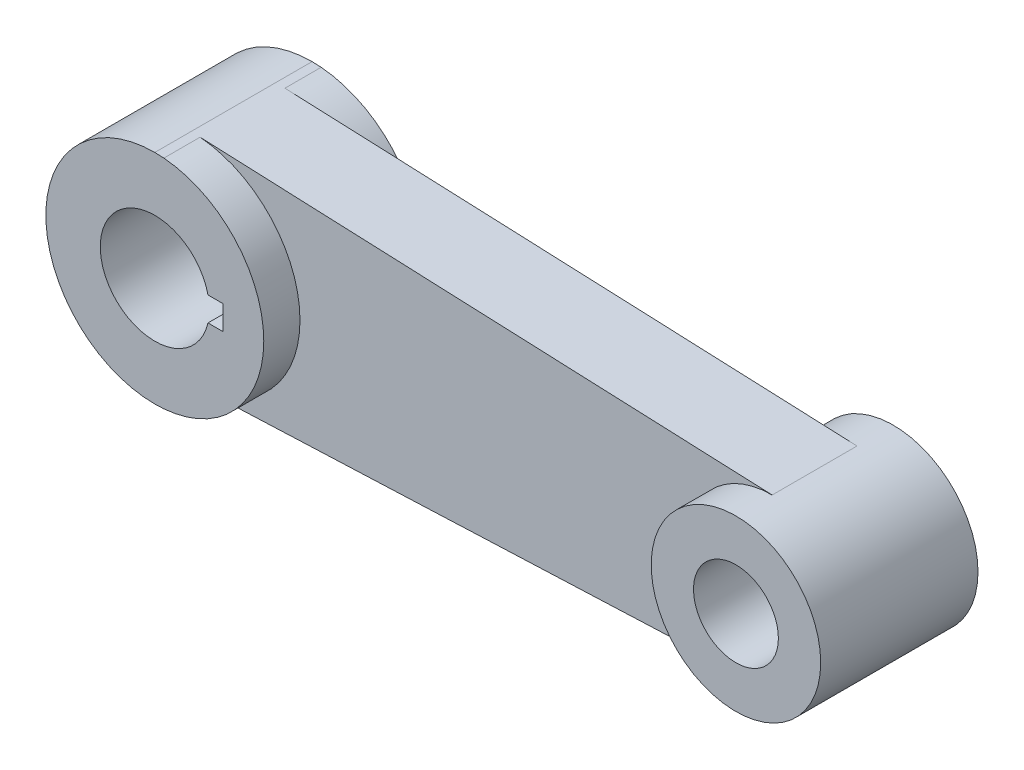
ISO-10303-21;
HEADER;
FILE_DESCRIPTION(('STEP AP214'),'2;1');
FILE_NAME('part.step','',(''),(''),'','','');
FILE_SCHEMA(('AUTOMOTIVE_DESIGN { 1 0 10303 214 1 1 1 1 }'));
ENDSEC;
DATA;
#1=APPLICATION_CONTEXT('core data for automotive mechanical design processes');
#2=APPLICATION_PROTOCOL_DEFINITION('international standard','automotive_design',2000,#1);
#3=PRODUCT_CONTEXT('',#1,'mechanical');
#4=PRODUCT('Part','Part','',(#3));
#5=PRODUCT_RELATED_PRODUCT_CATEGORY('part','',(#4));
#6=PRODUCT_DEFINITION_FORMATION('','',#4);
#7=PRODUCT_DEFINITION_CONTEXT('part definition',#1,'design');
#8=PRODUCT_DEFINITION('design','',#6,#7);
#9=PRODUCT_DEFINITION_SHAPE('','',#8);
#10=(LENGTH_UNIT() NAMED_UNIT(*) SI_UNIT(.MILLI.,.METRE.));
#11=(NAMED_UNIT(*) PLANE_ANGLE_UNIT() SI_UNIT($,.RADIAN.));
#12=(NAMED_UNIT(*) SI_UNIT($,.STERADIAN.) SOLID_ANGLE_UNIT());
#13=UNCERTAINTY_MEASURE_WITH_UNIT(LENGTH_MEASURE(1.E-05),#10,'distance_accuracy_value','');
#14=(GEOMETRIC_REPRESENTATION_CONTEXT(3) GLOBAL_UNCERTAINTY_ASSIGNED_CONTEXT((#13)) GLOBAL_UNIT_ASSIGNED_CONTEXT((#10,
#11,#12)) REPRESENTATION_CONTEXT('',''));
#15=CARTESIAN_POINT('',(0.,0.,0.));
#16=DIRECTION('',(0.,0.,1.));
#17=DIRECTION('',(1.,0.,0.));
#18=AXIS2_PLACEMENT_3D('',#15,#16,#17);
#19=CARTESIAN_POINT('',(0.,0.,0.));
#20=DIRECTION('',(0.,0.,0.999999999999987));
#21=DIRECTION('',(1.00000000000001,0.,0.));
#22=AXIS2_PLACEMENT_3D('',#19,#20,#21);
#23=PLANE('',#22);
#24=DIRECTION('',(0.999133073092356,0.0416305447121818,0.));
#25=VECTOR('',#24,1.);
#26=CARTESIAN_POINT('',(0.594280762564944,-14.2627383015598,0.));
#27=LINE('',#26,#25);
#28=CARTESIAN_POINT('',(1.18856152512999,-14.2379766031196,0.));
#29=VERTEX_POINT('',#28);
#30=CARTESIAN_POINT('',(76.2000000000002,-11.1125,-5.27355936696949E-13));
#31=VERTEX_POINT('',#30);
#32=EDGE_CURVE('E171',#29,#31,#27,.T.);
#33=ORIENTED_EDGE('',*,*,#32,.T.);
#34=CARTESIAN_POINT('',(76.2,1.17961196366423E-13,-8.60422844084496E-13));
#35=DIRECTION('',(0.,0.,0.999999999999987));
#36=DIRECTION('',(1.00000000000001,0.,0.));
#37=AXIS2_PLACEMENT_3D('',#34,#35,#36);
#38=CIRCLE('',#37,11.1125);
#39=CARTESIAN_POINT('',(76.2000000000007,11.1125000000001,-8.04911692853238E-13));
#40=VERTEX_POINT('',#39);
#41=EDGE_CURVE('E156',#40,#31,#38,.T.);
#42=ORIENTED_EDGE('',*,*,#41,.F.);
#43=DIRECTION('',(0.999133073092362,-0.0416305447121823,0.));
#44=VECTOR('',#43,1.);
#45=CARTESIAN_POINT('',(0.594280762564986,14.2627383015601,-1.11022302462516E-13));
#46=LINE('',#45,#44);
#47=CARTESIAN_POINT('',(1.18856152512964,14.2379766031199,-3.05311331771918E-13));
#48=VERTEX_POINT('',#47);
#49=EDGE_CURVE('E61',#48,#40,#46,.T.);
#50=ORIENTED_EDGE('',*,*,#49,.F.);
#51=CARTESIAN_POINT('',(0.,0.,0.));
#52=DIRECTION('',(0.,0.,0.999999999999987));
#53=DIRECTION('',(1.00000000000001,0.,0.));
#54=AXIS2_PLACEMENT_3D('',#51,#52,#53);
#55=CIRCLE('',#54,14.2875);
#56=EDGE_CURVE('E180',#29,#48,#55,.T.);
#57=ORIENTED_EDGE('',*,*,#56,.F.);
#58=EDGE_LOOP('',(#33,#42,#50,#57));
#59=FACE_BOUND('',#58,.T.);
#60=ADVANCED_FACE('F38',(#59),#23,.T.);
#61=CARTESIAN_POINT('',(0.,0.,4.74980000000005));
#62=DIRECTION('',(0.,0.,-0.999999999999987));
#63=DIRECTION('',(-1.00000000000001,0.,0.));
#64=AXIS2_PLACEMENT_3D('',#61,#62,#63);
#65=CYLINDRICAL_SURFACE('',#64,14.2875);
#66=CARTESIAN_POINT('',(0.,0.,-11.1251999999999));
#67=DIRECTION('',(0.,0.,0.999999999999987));
#68=DIRECTION('',(1.00000000000001,0.,0.));
#69=AXIS2_PLACEMENT_3D('',#66,#67,#68);
#70=CIRCLE('',#69,14.2875);
#71=CARTESIAN_POINT('',(1.18856152512992,-14.2379766031196,-11.1251999999999));
#72=VERTEX_POINT('',#71);
#73=CARTESIAN_POINT('',(1.18856152513,14.2379766031199,-11.1251999999998));
#74=VERTEX_POINT('',#73);
#75=EDGE_CURVE('E173',#72,#74,#70,.T.);
#76=ORIENTED_EDGE('',*,*,#75,.F.);
#77=DIRECTION('',(0.,0.,-0.999999999999987));
#78=VECTOR('',#77,1.);
#79=CARTESIAN_POINT('',(1.18856152512993,-14.2379766031196,4.74979999999997));
#80=LINE('',#79,#78);
#81=CARTESIAN_POINT('',(1.18856152513007,-14.2379766031197,-15.8749999999996));
#82=VERTEX_POINT('',#81);
#83=EDGE_CURVE('E214',#72,#82,#80,.T.);
#84=ORIENTED_EDGE('',*,*,#83,.T.);
#85=CARTESIAN_POINT('',(0.,0.,-15.8749999999998));
#86=DIRECTION('',(0.,0.,0.999999999999987));
#87=DIRECTION('',(1.00000000000001,0.,0.));
#88=AXIS2_PLACEMENT_3D('',#85,#86,#87);
#89=CIRCLE('',#88,14.2875);
#90=CARTESIAN_POINT('',(1.18856152512999,14.2379766031199,-15.8749999999998));
#91=VERTEX_POINT('',#90);
#92=EDGE_CURVE('E197',#82,#91,#89,.T.);
#93=ORIENTED_EDGE('',*,*,#92,.T.);
#94=DIRECTION('',(0.,0.,-0.999999999999987));
#95=VECTOR('',#94,1.);
#96=CARTESIAN_POINT('',(1.18856152512987,14.2379766031199,4.74979999999992));
#97=LINE('',#96,#95);
#98=EDGE_CURVE('E215',#74,#91,#97,.T.);
#99=ORIENTED_EDGE('',*,*,#98,.F.);
#100=EDGE_LOOP('',(#76,#84,#93,#99));
#101=FACE_BOUND('',#100,.T.);
#102=ADVANCED_FACE('F248',(#101),#65,.T.);
#103=CARTESIAN_POINT('',(0.594280762564875,14.26273830156,4.74979999999997));
#104=DIRECTION('',(0.0416305447121815,0.999133073092369,0.));
#105=DIRECTION('',(-0.999133073092362,0.0416305447121823,0.));
#106=AXIS2_PLACEMENT_3D('',#103,#104,#105);
#107=PLANE('',#106);
#108=CARTESIAN_POINT('',(1.18856152512987,14.2379766031199,4.74979999999992));
#109=VERTEX_POINT('',#108);
#110=EDGE_CURVE('E211',#109,#48,#97,.T.);
#111=ORIENTED_EDGE('',*,*,#110,.T.);
#112=ORIENTED_EDGE('',*,*,#49,.T.);
#113=DIRECTION('',(0.,0.,0.999999999999987));
#114=VECTOR('',#113,1.);
#115=CARTESIAN_POINT('',(76.2000000000008,11.1125000000002,-11.1252000000007));
#116=LINE('',#115,#114);
#117=CARTESIAN_POINT('',(76.2000000000008,11.1125000000002,-11.1252000000007));
#118=VERTEX_POINT('',#117);
#119=EDGE_CURVE('E178',#118,#40,#116,.T.);
#120=ORIENTED_EDGE('',*,*,#119,.F.);
#121=DIRECTION('',(0.999133073092362,-0.0416305447121823,0.));
#122=VECTOR('',#121,1.);
#123=CARTESIAN_POINT('',(0.594280762564972,14.2627383015601,-11.1251999999999));
#124=LINE('',#123,#122);
#125=EDGE_CURVE('E170',#74,#118,#124,.T.);
#126=ORIENTED_EDGE('',*,*,#125,.F.);
#127=ORIENTED_EDGE('',*,*,#98,.T.);
#128=DIRECTION('',(0.999133073092362,-0.0416305447121823,0.));
#129=VECTOR('',#128,1.);
#130=CARTESIAN_POINT('',(0.594280762564972,14.2627383015601,-15.875));
#131=LINE('',#130,#129);
#132=CARTESIAN_POINT('',(0.,14.2875000000003,-15.8749999999999));
#133=VERTEX_POINT('',#132);
#134=EDGE_CURVE('E190',#133,#91,#131,.T.);
#135=ORIENTED_EDGE('',*,*,#134,.F.);
#136=DIRECTION('',(0.,0.,-0.999999999999987));
#137=VECTOR('',#136,1.);
#138=CARTESIAN_POINT('',(-1.11022302462516E-13,14.2875000000003,4.74979999999978));
#139=LINE('',#138,#137);
#140=CARTESIAN_POINT('',(-1.11022302462516E-13,14.2875000000003,4.74979999999978));
#141=VERTEX_POINT('',#140);
#142=EDGE_CURVE('E221',#141,#133,#139,.T.);
#143=ORIENTED_EDGE('',*,*,#142,.F.);
#144=DIRECTION('',(0.999133073092362,-0.0416305447121823,0.));
#145=VECTOR('',#144,1.);
#146=CARTESIAN_POINT('',(0.594280762564875,14.26273830156,4.74979999999997));
#147=LINE('',#146,#145);
#148=EDGE_CURVE('E201',#141,#109,#147,.T.);
#149=ORIENTED_EDGE('',*,*,#148,.T.);
#150=EDGE_LOOP('',(#111,#112,#120,#126,#127,#135,#143,#149));
#151=FACE_BOUND('',#150,.T.);
#152=ADVANCED_FACE('F253',(#151),#107,.T.);
#153=ORIENTED_EDGE('',*,*,#142,.T.);
#154=CARTESIAN_POINT('',(0.,-14.2875,-15.8749999999997));
#155=VERTEX_POINT('',#154);
#156=EDGE_CURVE('E193',#133,#155,#89,.T.);
#157=ORIENTED_EDGE('',*,*,#156,.T.);
#158=DIRECTION('',(0.,0.,-0.999999999999987));
#159=VECTOR('',#158,1.);
#160=CARTESIAN_POINT('',(0.,-14.2875,4.74979999999994));
#161=LINE('',#160,#159);
#162=CARTESIAN_POINT('',(0.,-14.2875,4.74979999999994));
#163=VERTEX_POINT('',#162);
#164=EDGE_CURVE('E219',#163,#155,#161,.T.);
#165=ORIENTED_EDGE('',*,*,#164,.F.);
#166=CARTESIAN_POINT('',(0.,0.,4.74980000000005));
#167=DIRECTION('',(0.,0.,0.999999999999987));
#168=DIRECTION('',(1.00000000000001,0.,0.));
#169=AXIS2_PLACEMENT_3D('',#166,#167,#168);
#170=CIRCLE('',#169,14.2875);
#171=EDGE_CURVE('E204',#141,#163,#170,.T.);
#172=ORIENTED_EDGE('',*,*,#171,.F.);
#173=EDGE_LOOP('',(#153,#157,#165,#172));
#174=FACE_BOUND('',#173,.T.);
#175=ADVANCED_FACE('F256',(#174),#65,.T.);
#176=CARTESIAN_POINT('',(0.594280762564875,-14.2627383015597,4.74980000000003));
#177=DIRECTION('',(-0.0416305447121819,0.999133073092361,0.));
#178=DIRECTION('',(-0.999133073092356,-0.0416305447121817,0.));
#179=AXIS2_PLACEMENT_3D('',#176,#177,#178);
#180=PLANE('',#179);
#181=ORIENTED_EDGE('',*,*,#164,.T.);
#182=DIRECTION('',(0.999133073092356,0.0416305447121818,0.));
#183=VECTOR('',#182,1.);
#184=CARTESIAN_POINT('',(0.594280762565028,-14.2627383015598,-15.8749999999998));
#185=LINE('',#184,#183);
#186=EDGE_CURVE('E196',#155,#82,#185,.T.);
#187=ORIENTED_EDGE('',*,*,#186,.T.);
#188=ORIENTED_EDGE('',*,*,#83,.F.);
#189=DIRECTION('',(0.999133073092356,0.0416305447121818,0.));
#190=VECTOR('',#189,1.);
#191=CARTESIAN_POINT('',(0.594280762565028,-14.2627383015598,-11.1251999999998));
#192=LINE('',#191,#190);
#193=CARTESIAN_POINT('',(76.2,-11.1125,-11.1252));
#194=VERTEX_POINT('',#193);
#195=EDGE_CURVE('E175',#72,#194,#192,.T.);
#196=ORIENTED_EDGE('',*,*,#195,.T.);
#197=DIRECTION('',(0.,0.,0.999999999999987));
#198=VECTOR('',#197,1.);
#199=CARTESIAN_POINT('',(76.2,-11.1125,-11.1252));
#200=LINE('',#199,#198);
#201=EDGE_CURVE('E183',#194,#31,#200,.T.);
#202=ORIENTED_EDGE('',*,*,#201,.T.);
#203=ORIENTED_EDGE('',*,*,#32,.F.);
#204=CARTESIAN_POINT('',(1.18856152512993,-14.2379766031196,4.74979999999997));
#205=VERTEX_POINT('',#204);
#206=EDGE_CURVE('E216',#205,#29,#80,.T.);
#207=ORIENTED_EDGE('',*,*,#206,.F.);
#208=DIRECTION('',(0.999133073092356,0.0416305447121818,0.));
#209=VECTOR('',#208,1.);
#210=CARTESIAN_POINT('',(0.594280762564875,-14.2627383015597,4.74980000000003));
#211=LINE('',#210,#209);
#212=EDGE_CURVE('E207',#163,#205,#211,.T.);
#213=ORIENTED_EDGE('',*,*,#212,.F.);
#214=EDGE_LOOP('',(#181,#187,#188,#196,#202,#203,#207,#213));
#215=FACE_BOUND('',#214,.T.);
#216=ADVANCED_FACE('F270',(#215),#180,.F.);
#217=CARTESIAN_POINT('',(0.,0.,4.74980000000005));
#218=DIRECTION('',(0.,0.,-0.999999999999987));
#219=DIRECTION('',(-1.00000000000001,0.,0.));
#220=AXIS2_PLACEMENT_3D('',#217,#218,#219);
#221=CYLINDRICAL_SURFACE('',#220,7.1501);
#222=DIRECTION('',(0.,0.,0.999999999999987));
#223=VECTOR('',#222,1.);
#224=CARTESIAN_POINT('',(6.97164067920887,1.58750000000017,-4.67359999999994));
#225=LINE('',#224,#223);
#226=CARTESIAN_POINT('',(6.97164067920887,1.58750000000017,-4.67359999999994));
#227=VERTEX_POINT('',#226);
#228=CARTESIAN_POINT('',(6.9716406792088,1.58750000000015,4.74979999999978));
#229=VERTEX_POINT('',#228);
#230=EDGE_CURVE('E162',#227,#229,#225,.T.);
#231=ORIENTED_EDGE('',*,*,#230,.T.);
#232=CARTESIAN_POINT('',(0.,0.,4.74980000000005));
#233=DIRECTION('',(0.,0.,0.999999999999987));
#234=DIRECTION('',(1.00000000000001,0.,0.));
#235=AXIS2_PLACEMENT_3D('',#232,#233,#234);
#236=CIRCLE('',#235,7.1501);
#237=CARTESIAN_POINT('',(6.97164067920878,-1.58749999999988,4.74979999999994));
#238=VERTEX_POINT('',#237);
#239=EDGE_CURVE('E145',#229,#238,#236,.T.);
#240=ORIENTED_EDGE('',*,*,#239,.T.);
#241=DIRECTION('',(0.,0.,0.999999999999987));
#242=VECTOR('',#241,1.);
#243=CARTESIAN_POINT('',(6.97164067920877,-1.58749999999993,-4.67360000000008));
#244=LINE('',#243,#242);
#245=CARTESIAN_POINT('',(6.97164067920877,-1.58749999999993,-4.67360000000008));
#246=VERTEX_POINT('',#245);
#247=EDGE_CURVE('E53',#246,#238,#244,.T.);
#248=ORIENTED_EDGE('',*,*,#247,.F.);
#249=CARTESIAN_POINT('',(0.,0.,-4.67359999999992));
#250=DIRECTION('',(0.,0.,-0.999999999999987));
#251=DIRECTION('',(-1.00000000000001,0.,0.));
#252=AXIS2_PLACEMENT_3D('',#249,#250,#251);
#253=CIRCLE('',#252,7.1501);
#254=EDGE_CURVE('E11',#227,#246,#253,.T.);
#255=ORIENTED_EDGE('',*,*,#254,.F.);
#256=EDGE_LOOP('',(#231,#240,#248,#255));
#257=FACE_BOUND('',#256,.T.);
#258=CARTESIAN_POINT('',(0.,0.,-15.8749999999998));
#259=DIRECTION('',(0.,0.,0.999999999999987));
#260=DIRECTION('',(1.00000000000001,0.,0.));
#261=AXIS2_PLACEMENT_3D('',#258,#259,#260);
#262=CIRCLE('',#261,7.1501);
#263=CARTESIAN_POINT('',(7.1501000000001,0.,-15.8749999999999));
#264=VERTEX_POINT('',#263);
#265=EDGE_CURVE('E186',#264,#264,#262,.T.);
#266=ORIENTED_EDGE('',*,*,#265,.F.);
#267=EDGE_LOOP('',(#266));
#268=FACE_BOUND('',#267,.T.);
#269=ADVANCED_FACE('F40',(#257,#268),#221,.F.);
#270=ORIENTED_EDGE('',*,*,#206,.T.);
#271=ORIENTED_EDGE('',*,*,#56,.T.);
#272=ORIENTED_EDGE('',*,*,#110,.F.);
#273=EDGE_CURVE('E208',#205,#109,#170,.T.);
#274=ORIENTED_EDGE('',*,*,#273,.F.);
#275=EDGE_LOOP('',(#270,#271,#272,#274));
#276=FACE_BOUND('',#275,.T.);
#277=ADVANCED_FACE('F257',(#276),#65,.T.);
#278=CARTESIAN_POINT('',(0.,0.,4.74980000000005));
#279=DIRECTION('',(0.,0.,0.999999999999987));
#280=DIRECTION('',(1.00000000000001,0.,0.));
#281=AXIS2_PLACEMENT_3D('',#278,#279,#280);
#282=PLANE('',#281);
#283=DIRECTION('',(-1.00000000000001,0.,0.));
#284=VECTOR('',#283,1.);
#285=CARTESIAN_POINT('',(-2.08166817117217E-13,1.58750000000016,4.74979999999983));
#286=LINE('',#285,#284);
#287=CARTESIAN_POINT('',(8.92744067920866,1.58750000000008,4.74979999999983));
#288=VERTEX_POINT('',#287);
#289=EDGE_CURVE('E46',#288,#229,#286,.T.);
#290=ORIENTED_EDGE('',*,*,#289,.F.);
#291=DIRECTION('',(0.,1.00000000000001,0.));
#292=VECTOR('',#291,1.);
#293=CARTESIAN_POINT('',(8.92744067920886,1.66533453693773E-13,4.74979999999992));
#294=LINE('',#293,#292);
#295=CARTESIAN_POINT('',(8.92744067920868,-1.5875,4.74979999999969));
#296=VERTEX_POINT('',#295);
#297=EDGE_CURVE('E225',#296,#288,#294,.T.);
#298=ORIENTED_EDGE('',*,*,#297,.F.);
#299=DIRECTION('',(1.00000000000001,0.,0.));
#300=VECTOR('',#299,1.);
#301=CARTESIAN_POINT('',(-1.66533453693773E-13,-1.58749999999983,4.74979999999986));
#302=LINE('',#301,#300);
#303=EDGE_CURVE('E223',#238,#296,#302,.T.);
#304=ORIENTED_EDGE('',*,*,#303,.F.);
#305=ORIENTED_EDGE('',*,*,#239,.F.);
#306=EDGE_LOOP('',(#290,#298,#304,#305));
#307=FACE_BOUND('',#306,.T.);
#308=ORIENTED_EDGE('',*,*,#148,.F.);
#309=ORIENTED_EDGE('',*,*,#171,.T.);
#310=ORIENTED_EDGE('',*,*,#212,.T.);
#311=ORIENTED_EDGE('',*,*,#273,.T.);
#312=EDGE_LOOP('',(#308,#309,#310,#311));
#313=FACE_BOUND('',#312,.T.);
#314=ADVANCED_FACE('F233',(#307,#313),#282,.T.);
#315=CARTESIAN_POINT('',(0.,0.,-15.8749999999998));
#316=DIRECTION('',(0.,0.,0.999999999999987));
#317=DIRECTION('',(1.00000000000001,0.,0.));
#318=AXIS2_PLACEMENT_3D('',#315,#316,#317);
#319=PLANE('',#318);
#320=ORIENTED_EDGE('',*,*,#265,.T.);
#321=EDGE_LOOP('',(#320));
#322=FACE_BOUND('',#321,.T.);
#323=ORIENTED_EDGE('',*,*,#134,.T.);
#324=ORIENTED_EDGE('',*,*,#92,.F.);
#325=ORIENTED_EDGE('',*,*,#186,.F.);
#326=ORIENTED_EDGE('',*,*,#156,.F.);
#327=EDGE_LOOP('',(#323,#324,#325,#326));
#328=FACE_BOUND('',#327,.T.);
#329=ADVANCED_FACE('F262',(#322,#328),#319,.F.);
#330=CARTESIAN_POINT('',(0.,0.,-11.1251999999999));
#331=DIRECTION('',(0.,0.,0.999999999999987));
#332=DIRECTION('',(1.00000000000001,0.,0.));
#333=AXIS2_PLACEMENT_3D('',#330,#331,#332);
#334=PLANE('',#333);
#335=CARTESIAN_POINT('',(76.2000000000001,1.73472347597681E-13,-11.1252000000007));
#336=DIRECTION('',(0.,0.,0.999999999999987));
#337=DIRECTION('',(1.00000000000001,0.,0.));
#338=AXIS2_PLACEMENT_3D('',#335,#336,#337);
#339=CIRCLE('',#338,11.1125);
#340=EDGE_CURVE('E168',#118,#194,#339,.T.);
#341=ORIENTED_EDGE('',*,*,#340,.T.);
#342=ORIENTED_EDGE('',*,*,#195,.F.);
#343=ORIENTED_EDGE('',*,*,#75,.T.);
#344=ORIENTED_EDGE('',*,*,#125,.T.);
#345=EDGE_LOOP('',(#341,#342,#343,#344));
#346=FACE_BOUND('',#345,.T.);
#347=ADVANCED_FACE('F260',(#346),#334,.F.);
#348=CARTESIAN_POINT('',(76.2,0.,-15.8750000000004));
#349=DIRECTION('',(0.,0.,0.999999999999987));
#350=DIRECTION('',(1.00000000000001,0.,0.));
#351=AXIS2_PLACEMENT_3D('',#348,#349,#350);
#352=CYLINDRICAL_SURFACE('',#351,5.5626);
#353=CARTESIAN_POINT('',(76.2,0.,-15.8750000000004));
#354=DIRECTION('',(0.,0.,0.999999999999987));
#355=DIRECTION('',(1.00000000000001,0.,0.));
#356=AXIS2_PLACEMENT_3D('',#353,#354,#355);
#357=CIRCLE('',#356,5.5626);
#358=CARTESIAN_POINT('',(81.7626,0.,-15.8750000000004));
#359=VERTEX_POINT('',#358);
#360=EDGE_CURVE('E159',#359,#359,#357,.T.);
#361=CARTESIAN_POINT('',(76.2000000000001,1.52655665885959E-13,4.74979999999911));
#362=DIRECTION('',(0.,0.,0.999999999999987));
#363=DIRECTION('',(1.00000000000001,0.,0.));
#364=AXIS2_PLACEMENT_3D('',#361,#362,#363);
#365=CIRCLE('',#364,5.5626);
#366=CARTESIAN_POINT('',(81.7625999999999,0.,4.74979999999915));
#367=VERTEX_POINT('',#366);
#368=EDGE_CURVE('E152',#367,#367,#365,.T.);
#369=CARTESIAN_POINT('',(81.7626,0.,-15.8750000000004));
#370=CARTESIAN_POINT('',(81.7626,0.,-15.6601583333337));
#371=CARTESIAN_POINT('',(81.7626,0.,-15.4453166666671));
#372=CARTESIAN_POINT('',(81.7626,0.,-15.0156333333337));
#373=CARTESIAN_POINT('',(81.7626,0.,-14.8007916666671));
#374=CARTESIAN_POINT('',(81.7626,0.,-14.3711083333337));
#375=CARTESIAN_POINT('',(81.7626,0.,-14.1562666666671));
#376=CARTESIAN_POINT('',(81.7626,0.,-13.7265833333338));
#377=CARTESIAN_POINT('',(81.7626,0.,-13.5117416666671));
#378=CARTESIAN_POINT('',(81.7626,0.,-13.0820583333338));
#379=CARTESIAN_POINT('',(81.7626,0.,-12.8672166666671));
#380=CARTESIAN_POINT('',(81.7626,0.,-12.4375333333338));
#381=CARTESIAN_POINT('',(81.7626,0.,-12.2226916666671));
#382=CARTESIAN_POINT('',(81.7626,0.,-11.7930083333338));
#383=CARTESIAN_POINT('',(81.7626,0.,-11.5781666666671));
#384=CARTESIAN_POINT('',(81.7626,0.,-11.1484833333338));
#385=CARTESIAN_POINT('',(81.7626,0.,-10.9336416666672));
#386=CARTESIAN_POINT('',(81.7626,0.,-10.5039583333338));
#387=CARTESIAN_POINT('',(81.7626,0.,-10.2891166666672));
#388=CARTESIAN_POINT('',(81.7626,0.,-9.85943333333385));
#389=CARTESIAN_POINT('',(81.7626,0.,-9.64459166666718));
#390=CARTESIAN_POINT('',(81.7626,0.,-9.21490833333386));
#391=CARTESIAN_POINT('',(81.7626,0.,-9.0000666666672));
#392=CARTESIAN_POINT('',(81.7626,0.,-8.57038333333387));
#393=CARTESIAN_POINT('',(81.7626,0.,-8.35554166666721));
#394=CARTESIAN_POINT('',(81.7626,0.,-7.92585833333389));
#395=CARTESIAN_POINT('',(81.7626,0.,-7.71101666666723));
#396=CARTESIAN_POINT('',(81.7626,0.,-7.2813333333339));
#397=CARTESIAN_POINT('',(81.7626,0.,-7.06649166666724));
#398=CARTESIAN_POINT('',(81.7626,0.,-6.63680833333392));
#399=CARTESIAN_POINT('',(81.7626,0.,-6.42196666666726));
#400=CARTESIAN_POINT('',(81.7626,0.,-5.99228333333393));
#401=CARTESIAN_POINT('',(81.7625999999999,0.,-5.77744166666727));
#402=CARTESIAN_POINT('',(81.7625999999999,0.,-5.34775833333395));
#403=CARTESIAN_POINT('',(81.7625999999999,0.,-5.13291666666729));
#404=CARTESIAN_POINT('',(81.7625999999999,0.,-4.70323333333396));
#405=CARTESIAN_POINT('',(81.7625999999999,0.,-4.4883916666673));
#406=CARTESIAN_POINT('',(81.7625999999999,0.,-4.05870833333398));
#407=CARTESIAN_POINT('',(81.7625999999999,0.,-3.84386666666732));
#408=CARTESIAN_POINT('',(81.7625999999999,0.,-3.41418333333399));
#409=CARTESIAN_POINT('',(81.7625999999999,0.,-3.19934166666733));
#410=CARTESIAN_POINT('',(81.7625999999999,0.,-2.76965833333401));
#411=CARTESIAN_POINT('',(81.7625999999999,0.,-2.55481666666735));
#412=CARTESIAN_POINT('',(81.7625999999999,0.,-2.12513333333402));
#413=CARTESIAN_POINT('',(81.7625999999999,0.,-1.91029166666736));
#414=CARTESIAN_POINT('',(81.7625999999999,0.,-1.48060833333404));
#415=CARTESIAN_POINT('',(81.7625999999999,0.,-1.26576666666737));
#416=CARTESIAN_POINT('',(81.7625999999999,0.,-0.836083333334051));
#417=CARTESIAN_POINT('',(81.7625999999999,0.,-0.621241666667389));
#418=CARTESIAN_POINT('',(81.7625999999999,0.,-0.191558333334067));
#419=CARTESIAN_POINT('',(81.7625999999999,0.,0.0232833333325948));
#420=CARTESIAN_POINT('',(81.7625999999999,0.,0.452966666665917));
#421=CARTESIAN_POINT('',(81.7625999999999,0.,0.667808333332578));
#422=CARTESIAN_POINT('',(81.7625999999999,0.,1.0974916666659));
#423=CARTESIAN_POINT('',(81.7625999999999,0.,1.31233333333257));
#424=CARTESIAN_POINT('',(81.7625999999999,0.,1.74201666666589));
#425=CARTESIAN_POINT('',(81.7625999999999,0.,1.95685833333255));
#426=CARTESIAN_POINT('',(81.7625999999999,0.,2.38654166666587));
#427=CARTESIAN_POINT('',(81.7625999999999,0.,2.60138333333254));
#428=CARTESIAN_POINT('',(81.7625999999999,0.,3.03106666666586));
#429=CARTESIAN_POINT('',(81.7625999999999,0.,3.24590833333252));
#430=CARTESIAN_POINT('',(81.7625999999999,0.,3.67559166666585));
#431=CARTESIAN_POINT('',(81.7625999999999,0.,3.89043333333251));
#432=CARTESIAN_POINT('',(81.7625999999999,0.,4.32011666666583));
#433=CARTESIAN_POINT('',(81.7625999999999,0.,4.53495833333249));
#434=CARTESIAN_POINT('',(81.7625999999999,0.,4.74979999999915));
#435=B_SPLINE_CURVE_WITH_KNOTS('',3,(#369,#370,#371,#372,#373,#374,#375,#376,#377,#378,#379,
#380,#381,#382,#383,#384,#385,#386,#387,#388,#389,#390,#391,#392,#393,#394,#395,#396,#397,#398,
#399,#400,#401,#402,#403,#404,#405,#406,#407,#408,#409,#410,#411,#412,#413,#414,#415,#416,#417,
#418,#419,#420,#421,#422,#423,#424,#425,#426,#427,#428,#429,#430,#431,#432,#433,#434),
.UNSPECIFIED.,.F.,.F.,(4,2,2,2,2,2,2,2,2,2,2,2,2,2,2,2,2,2,2,2,2,2,2,2,2,2,2,2,2,2,2,2,4),(0.,
0.644524999999986,1.28904999999997,1.93357499999996,2.57809999999994,3.22262499999993,
3.86714999999991,4.5116749999999,5.15619999999988,5.80072499999987,6.44524999999985,
7.08977499999984,7.73429999999982,8.37882499999981,9.02334999999979,9.66787499999978,
10.3123999999998,10.9569249999997,11.6014499999997,12.2459749999997,12.8904999999997,
13.5350249999997,14.1795499999997,14.8240749999997,15.4685999999996,16.1131249999996,
16.7576499999996,17.4021749999996,18.0466999999996,18.6912249999996,19.3357499999996,
19.9802749999995,20.6247999999995),.UNSPECIFIED.);
#436=EDGE_CURVE('BSEAM303',#359,#367,#435,.T.);
#437=ORIENTED_EDGE('',*,*,#360,.F.);
#438=ORIENTED_EDGE('',*,*,#368,.T.);
#439=ORIENTED_EDGE('',*,*,#436,.T.);
#440=ORIENTED_EDGE('',*,*,#436,.F.);
#441=EDGE_LOOP('',(#437,#439,#438,#440));
#442=FACE_BOUND('',#441,.T.);
#443=ADVANCED_FACE('F303',(#442),#352,.F.);
#444=CARTESIAN_POINT('',(76.2,0.,-15.8750000000004));
#445=DIRECTION('',(0.,0.,0.999999999999987));
#446=DIRECTION('',(1.00000000000001,0.,0.));
#447=AXIS2_PLACEMENT_3D('',#444,#445,#446);
#448=CYLINDRICAL_SURFACE('',#447,11.1125);
#449=ORIENTED_EDGE('',*,*,#340,.F.);
#450=ORIENTED_EDGE('',*,*,#119,.T.);
#451=ORIENTED_EDGE('',*,*,#41,.T.);
#452=ORIENTED_EDGE('',*,*,#201,.F.);
#453=EDGE_LOOP('',(#449,#450,#451,#452));
#454=FACE_BOUND('',#453,.T.);
#455=CARTESIAN_POINT('',(76.2,0.,-15.8750000000004));
#456=DIRECTION('',(0.,0.,0.999999999999987));
#457=DIRECTION('',(1.00000000000001,0.,0.));
#458=AXIS2_PLACEMENT_3D('',#455,#456,#457);
#459=CIRCLE('',#458,11.1125);
#460=CARTESIAN_POINT('',(87.3125000000001,0.,-15.8750000000005));
#461=VERTEX_POINT('',#460);
#462=EDGE_CURVE('E165',#461,#461,#459,.T.);
#463=ORIENTED_EDGE('',*,*,#462,.T.);
#464=EDGE_LOOP('',(#463));
#465=FACE_BOUND('',#464,.T.);
#466=CARTESIAN_POINT('',(76.2000000000001,1.52655665885959E-13,4.74979999999911));
#467=DIRECTION('',(0.,0.,0.999999999999987));
#468=DIRECTION('',(1.00000000000001,0.,0.));
#469=AXIS2_PLACEMENT_3D('',#466,#467,#468);
#470=CIRCLE('',#469,11.1125);
#471=CARTESIAN_POINT('',(87.3125000000001,1.5030385790149E-13,4.74979999999901));
#472=VERTEX_POINT('',#471);
#473=EDGE_CURVE('E155',#472,#472,#470,.T.);
#474=ORIENTED_EDGE('',*,*,#473,.F.);
#475=EDGE_LOOP('',(#474));
#476=FACE_BOUND('',#475,.T.);
#477=ADVANCED_FACE('F288',(#454,#465,#476),#448,.T.);
#478=CARTESIAN_POINT('',(0.,0.,-15.8749999999998));
#479=DIRECTION('',(0.,0.,0.999999999999987));
#480=DIRECTION('',(1.00000000000001,0.,0.));
#481=AXIS2_PLACEMENT_3D('',#478,#479,#480);
#482=PLANE('',#481);
#483=ORIENTED_EDGE('',*,*,#360,.T.);
#484=EDGE_LOOP('',(#483));
#485=FACE_BOUND('',#484,.T.);
#486=ORIENTED_EDGE('',*,*,#462,.F.);
#487=EDGE_LOOP('',(#486));
#488=FACE_BOUND('',#487,.T.);
#489=ADVANCED_FACE('F311',(#485,#488),#482,.F.);
#490=CARTESIAN_POINT('',(0.,0.,4.74980000000005));
#491=DIRECTION('',(0.,0.,0.999999999999987));
#492=DIRECTION('',(1.00000000000001,0.,0.));
#493=AXIS2_PLACEMENT_3D('',#490,#491,#492);
#494=PLANE('',#493);
#495=ORIENTED_EDGE('',*,*,#368,.F.);
#496=EDGE_LOOP('',(#495));
#497=FACE_BOUND('',#496,.T.);
#498=ORIENTED_EDGE('',*,*,#473,.T.);
#499=EDGE_LOOP('',(#498));
#500=FACE_BOUND('',#499,.T.);
#501=ADVANCED_FACE('F245',(#497,#500),#494,.T.);
#502=CARTESIAN_POINT('',(6.97164067920887,1.58750000000017,-4.67359999999994));
#503=DIRECTION('',(0.,1.00000000000001,0.));
#504=DIRECTION('',(0.,0.,0.999999999999987));
#505=AXIS2_PLACEMENT_3D('',#502,#503,#504);
#506=PLANE('',#505);
#507=ORIENTED_EDGE('',*,*,#289,.T.);
#508=ORIENTED_EDGE('',*,*,#230,.F.);
#509=DIRECTION('',(-1.00000000000001,0.,0.));
#510=VECTOR('',#509,1.);
#511=CARTESIAN_POINT('',(6.97164067920887,1.58750000000017,-4.67359999999994));
#512=LINE('',#511,#510);
#513=CARTESIAN_POINT('',(8.9274406792089,1.5875,-4.67360000000006));
#514=VERTEX_POINT('',#513);
#515=EDGE_CURVE('E133',#514,#227,#512,.T.);
#516=ORIENTED_EDGE('',*,*,#515,.F.);
#517=DIRECTION('',(0.,0.,0.999999999999987));
#518=VECTOR('',#517,1.);
#519=CARTESIAN_POINT('',(8.9274406792089,1.5875,-4.67360000000006));
#520=LINE('',#519,#518);
#521=EDGE_CURVE('E147',#514,#288,#520,.T.);
#522=ORIENTED_EDGE('',*,*,#521,.T.);
#523=EDGE_LOOP('',(#507,#508,#516,#522));
#524=FACE_BOUND('',#523,.T.);
#525=ADVANCED_FACE('F229',(#524),#506,.F.);
#526=CARTESIAN_POINT('',(8.9274406792089,1.5875,-4.67360000000006));
#527=DIRECTION('',(1.00000000000001,0.,0.));
#528=DIRECTION('',(0.,0.,-0.999999999999987));
#529=AXIS2_PLACEMENT_3D('',#526,#527,#528);
#530=PLANE('',#529);
#531=ORIENTED_EDGE('',*,*,#297,.T.);
#532=ORIENTED_EDGE('',*,*,#521,.F.);
#533=DIRECTION('',(0.,1.00000000000001,0.));
#534=VECTOR('',#533,1.);
#535=CARTESIAN_POINT('',(8.9274406792089,1.5875,-4.67360000000006));
#536=LINE('',#535,#534);
#537=CARTESIAN_POINT('',(8.92744067920893,-1.58749999999999,-4.67360000000008));
#538=VERTEX_POINT('',#537);
#539=EDGE_CURVE('E140',#538,#514,#536,.T.);
#540=ORIENTED_EDGE('',*,*,#539,.F.);
#541=DIRECTION('',(0.,0.,0.999999999999987));
#542=VECTOR('',#541,1.);
#543=CARTESIAN_POINT('',(8.92744067920893,-1.58749999999999,-4.67360000000008));
#544=LINE('',#543,#542);
#545=EDGE_CURVE('E138',#538,#296,#544,.T.);
#546=ORIENTED_EDGE('',*,*,#545,.T.);
#547=EDGE_LOOP('',(#531,#532,#540,#546));
#548=FACE_BOUND('',#547,.T.);
#549=ADVANCED_FACE('F236',(#548),#530,.F.);
#550=CARTESIAN_POINT('',(8.92744067920893,-1.58749999999999,-4.67360000000008));
#551=DIRECTION('',(0.,-1.00000000000001,0.));
#552=DIRECTION('',(1.00000000000001,0.,0.));
#553=AXIS2_PLACEMENT_3D('',#550,#551,#552);
#554=PLANE('',#553);
#555=ORIENTED_EDGE('',*,*,#303,.T.);
#556=ORIENTED_EDGE('',*,*,#545,.F.);
#557=DIRECTION('',(1.00000000000001,0.,0.));
#558=VECTOR('',#557,1.);
#559=CARTESIAN_POINT('',(8.92744067920893,-1.58749999999999,-4.67360000000008));
#560=LINE('',#559,#558);
#561=EDGE_CURVE('E131',#246,#538,#560,.T.);
#562=ORIENTED_EDGE('',*,*,#561,.F.);
#563=ORIENTED_EDGE('',*,*,#247,.T.);
#564=EDGE_LOOP('',(#555,#556,#562,#563));
#565=FACE_BOUND('',#564,.T.);
#566=ADVANCED_FACE('F136',(#565),#554,.F.);
#567=CARTESIAN_POINT('',(0.,0.,-4.67359999999992));
#568=DIRECTION('',(0.,0.,-0.999999999999987));
#569=DIRECTION('',(-1.00000000000001,0.,0.));
#570=AXIS2_PLACEMENT_3D('',#567,#568,#569);
#571=PLANE('',#570);
#572=ORIENTED_EDGE('',*,*,#254,.T.);
#573=ORIENTED_EDGE('',*,*,#561,.T.);
#574=ORIENTED_EDGE('',*,*,#539,.T.);
#575=ORIENTED_EDGE('',*,*,#515,.T.);
#576=EDGE_LOOP('',(#572,#573,#574,#575));
#577=FACE_BOUND('',#576,.T.);
#578=ADVANCED_FACE('F129',(#577),#571,.F.);
#579=CLOSED_SHELL('',(#60,#102,#152,#175,#216,#269,#277,#314,#329,#347,#443,#477,#489,#501,#525,
#549,#566,#578));
#580=MANIFOLD_SOLID_BREP('B2',#579);
#581=ADVANCED_BREP_SHAPE_REPRESENTATION('',(#18,#580),#14);
#582=SHAPE_DEFINITION_REPRESENTATION(#9,#581);
ENDSEC;
END-ISO-10303-21;
